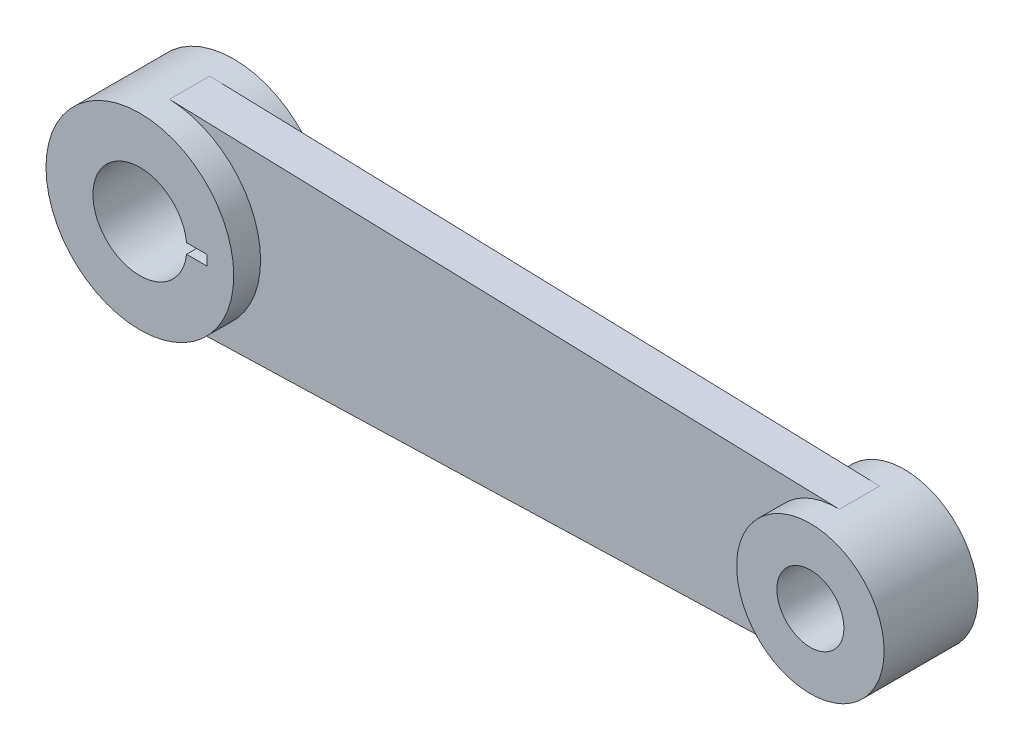
ISO-10303-21;
HEADER;
FILE_DESCRIPTION(('STEP AP214'),'2;1');
FILE_NAME('part.step','',(''),(''),'','','');
FILE_SCHEMA(('AUTOMOTIVE_DESIGN { 1 0 10303 214 1 1 1 1 }'));
ENDSEC;
DATA;
#1=APPLICATION_CONTEXT('core data for automotive mechanical design processes');
#2=APPLICATION_PROTOCOL_DEFINITION('international standard','automotive_design',2000,#1);
#3=PRODUCT_CONTEXT('',#1,'mechanical');
#4=PRODUCT('Part','Part','',(#3));
#5=PRODUCT_RELATED_PRODUCT_CATEGORY('part','',(#4));
#6=PRODUCT_DEFINITION_FORMATION('','',#4);
#7=PRODUCT_DEFINITION_CONTEXT('part definition',#1,'design');
#8=PRODUCT_DEFINITION('design','',#6,#7);
#9=PRODUCT_DEFINITION_SHAPE('','',#8);
#10=(LENGTH_UNIT() NAMED_UNIT(*) SI_UNIT(.MILLI.,.METRE.));
#11=(NAMED_UNIT(*) PLANE_ANGLE_UNIT() SI_UNIT($,.RADIAN.));
#12=(NAMED_UNIT(*) SI_UNIT($,.STERADIAN.) SOLID_ANGLE_UNIT());
#13=UNCERTAINTY_MEASURE_WITH_UNIT(LENGTH_MEASURE(1.E-05),#10,'distance_accuracy_value','');
#14=(GEOMETRIC_REPRESENTATION_CONTEXT(3) GLOBAL_UNCERTAINTY_ASSIGNED_CONTEXT((#13)) GLOBAL_UNIT_ASSIGNED_CONTEXT((#10,
#11,#12)) REPRESENTATION_CONTEXT('',''));
#15=CARTESIAN_POINT('',(0.,0.,0.));
#16=DIRECTION('',(0.,0.,1.));
#17=DIRECTION('',(1.,0.,0.));
#18=AXIS2_PLACEMENT_3D('',#15,#16,#17);
#19=CARTESIAN_POINT('',(-27.2035241619968,0.,6.));
#20=DIRECTION('',(0.,0.,-1.));
#21=DIRECTION('',(-1.,0.,0.));
#22=AXIS2_PLACEMENT_3D('',#19,#20,#21);
#23=PLANE('',#22);
#24=CARTESIAN_POINT('',(72.7964758380032,0.,6.));
#25=DIRECTION('',(0.,0.,-1.));
#26=DIRECTION('',(-1.,0.,0.));
#27=AXIS2_PLACEMENT_3D('',#24,#25,#26);
#28=CIRCLE('',#27,11.);
#29=CARTESIAN_POINT('',(73.1264758380032,10.9950488857485,6.));
#30=VERTEX_POINT('',#29);
#31=CARTESIAN_POINT('',(73.1264758380032,-10.9950488857485,6.));
#32=VERTEX_POINT('',#31);
#33=EDGE_CURVE('E149',#30,#32,#28,.F.);
#34=ORIENTED_EDGE('',*,*,#33,.F.);
#35=DIRECTION('',(-0.999549898704412,0.03,0.));
#36=VECTOR('',#35,1.);
#37=CARTESIAN_POINT('',(-26.7835241619968,13.9936985818618,6.));
#38=LINE('',#37,#36);
#39=CARTESIAN_POINT('',(-26.7835241619968,13.9936985818618,6.));
#40=VERTEX_POINT('',#39);
#41=EDGE_CURVE('E165',#30,#40,#38,.T.);
#42=ORIENTED_EDGE('',*,*,#41,.T.);
#43=CARTESIAN_POINT('',(-27.2035241619968,0.,6.));
#44=DIRECTION('',(0.,0.,-1.));
#45=DIRECTION('',(-1.,0.,0.));
#46=AXIS2_PLACEMENT_3D('',#43,#44,#45);
#47=CIRCLE('',#46,14.);
#48=CARTESIAN_POINT('',(-26.7835241619968,-13.9936985818618,6.));
#49=VERTEX_POINT('',#48);
#50=EDGE_CURVE('E156',#49,#40,#47,.F.);
#51=ORIENTED_EDGE('',*,*,#50,.F.);
#52=DIRECTION('',(0.999549898704412,0.03,0.));
#53=VECTOR('',#52,1.);
#54=CARTESIAN_POINT('',(73.1264758380032,-10.9950488857485,6.));
#55=LINE('',#54,#53);
#56=EDGE_CURVE('E162',#49,#32,#55,.T.);
#57=ORIENTED_EDGE('',*,*,#56,.T.);
#58=EDGE_LOOP('',(#34,#42,#51,#57));
#59=FACE_BOUND('',#58,.T.);
#60=ADVANCED_FACE('F35',(#59),#23,.F.);
#61=CARTESIAN_POINT('',(-27.2035241619968,0.,0.));
#62=DIRECTION('',(0.,0.,-1.));
#63=DIRECTION('',(-1.,0.,0.));
#64=AXIS2_PLACEMENT_3D('',#61,#62,#63);
#65=PLANE('',#64);
#66=DIRECTION('',(-0.999549898704412,0.03,0.));
#67=VECTOR('',#66,1.);
#68=CARTESIAN_POINT('',(-26.7835241619968,13.9936985818618,0.));
#69=LINE('',#68,#67);
#70=CARTESIAN_POINT('',(73.1264758380032,10.9950488857485,0.));
#71=VERTEX_POINT('',#70);
#72=CARTESIAN_POINT('',(-26.7835241619968,13.9936985818618,0.));
#73=VERTEX_POINT('',#72);
#74=EDGE_CURVE('E166',#71,#73,#69,.T.);
#75=ORIENTED_EDGE('',*,*,#74,.F.);
#76=CARTESIAN_POINT('',(72.7964758380032,0.,0.));
#77=DIRECTION('',(0.,0.,-1.));
#78=DIRECTION('',(-1.,0.,0.));
#79=AXIS2_PLACEMENT_3D('',#76,#77,#78);
#80=CIRCLE('',#79,11.);
#81=CARTESIAN_POINT('',(73.1264758380032,-10.9950488857485,0.));
#82=VERTEX_POINT('',#81);
#83=EDGE_CURVE('E145',#71,#82,#80,.F.);
#84=ORIENTED_EDGE('',*,*,#83,.T.);
#85=DIRECTION('',(0.999549898704412,0.03,0.));
#86=VECTOR('',#85,1.);
#87=CARTESIAN_POINT('',(73.1264758380032,-10.9950488857485,0.));
#88=LINE('',#87,#86);
#89=CARTESIAN_POINT('',(-26.7835241619968,-13.9936985818618,0.));
#90=VERTEX_POINT('',#89);
#91=EDGE_CURVE('E161',#90,#82,#88,.T.);
#92=ORIENTED_EDGE('',*,*,#91,.F.);
#93=CARTESIAN_POINT('',(-27.2035241619968,0.,0.));
#94=DIRECTION('',(0.,0.,-1.));
#95=DIRECTION('',(-1.,0.,0.));
#96=AXIS2_PLACEMENT_3D('',#93,#94,#95);
#97=CIRCLE('',#96,14.);
#98=EDGE_CURVE('E11',#90,#73,#97,.F.);
#99=ORIENTED_EDGE('',*,*,#98,.T.);
#100=EDGE_LOOP('',(#75,#84,#92,#99));
#101=FACE_BOUND('',#100,.T.);
#102=ADVANCED_FACE('F191',(#101),#65,.T.);
#103=CARTESIAN_POINT('',(-27.2035241619968,0.,6.));
#104=DIRECTION('',(0.,0.,-1.));
#105=DIRECTION('',(-1.,0.,0.));
#106=AXIS2_PLACEMENT_3D('',#103,#104,#105);
#107=CYLINDRICAL_SURFACE('',#106,14.);
#108=DIRECTION('',(0.,0.,-1.));
#109=VECTOR('',#108,1.);
#110=CARTESIAN_POINT('',(-26.7835241619968,13.9936985818618,6.));
#111=LINE('',#110,#109);
#112=EDGE_CURVE('E168',#40,#73,#111,.T.);
#113=ORIENTED_EDGE('',*,*,#112,.T.);
#114=ORIENTED_EDGE('',*,*,#98,.F.);
#115=DIRECTION('',(0.,0.,-1.));
#116=VECTOR('',#115,1.);
#117=CARTESIAN_POINT('',(-26.7835241619968,-13.9936985818618,6.));
#118=LINE('',#117,#116);
#119=EDGE_CURVE('E43',#49,#90,#118,.T.);
#120=ORIENTED_EDGE('',*,*,#119,.F.);
#121=ORIENTED_EDGE('',*,*,#50,.T.);
#122=EDGE_LOOP('',(#113,#114,#120,#121));
#123=FACE_BOUND('',#122,.T.);
#124=CARTESIAN_POINT('',(-27.2035241619968,0.,-4.));
#125=DIRECTION('',(0.,0.,1.));
#126=DIRECTION('',(1.,0.,0.));
#127=AXIS2_PLACEMENT_3D('',#124,#125,#126);
#128=CIRCLE('',#127,14.);
#129=CARTESIAN_POINT('',(-13.2035241619968,0.,-4.));
#130=VERTEX_POINT('',#129);
#131=EDGE_CURVE('E152',#130,#130,#128,.T.);
#132=ORIENTED_EDGE('',*,*,#131,.T.);
#133=EDGE_LOOP('',(#132));
#134=FACE_BOUND('',#133,.T.);
#135=CARTESIAN_POINT('',(-27.2035241619968,0.,10.));
#136=DIRECTION('',(0.,0.,1.));
#137=DIRECTION('',(1.,0.,0.));
#138=AXIS2_PLACEMENT_3D('',#135,#136,#137);
#139=CIRCLE('',#138,14.);
#140=CARTESIAN_POINT('',(-13.2035241619968,0.,10.));
#141=VERTEX_POINT('',#140);
#142=EDGE_CURVE('E153',#141,#141,#139,.T.);
#143=ORIENTED_EDGE('',*,*,#142,.F.);
#144=EDGE_LOOP('',(#143));
#145=FACE_BOUND('',#144,.T.);
#146=ADVANCED_FACE('F37',(#123,#134,#145),#107,.T.);
#147=CARTESIAN_POINT('',(73.1264758380032,-10.9950488857485,6.));
#148=DIRECTION('',(-0.03,0.999549898704412,0.));
#149=DIRECTION('',(-0.999549898704412,-0.03,0.));
#150=AXIS2_PLACEMENT_3D('',#147,#148,#149);
#151=PLANE('',#150);
#152=ORIENTED_EDGE('',*,*,#91,.T.);
#153=DIRECTION('',(0.,0.,-1.));
#154=VECTOR('',#153,1.);
#155=CARTESIAN_POINT('',(73.1264758380032,-10.9950488857485,6.));
#156=LINE('',#155,#154);
#157=EDGE_CURVE('E178',#32,#82,#156,.T.);
#158=ORIENTED_EDGE('',*,*,#157,.F.);
#159=ORIENTED_EDGE('',*,*,#56,.F.);
#160=ORIENTED_EDGE('',*,*,#119,.T.);
#161=EDGE_LOOP('',(#152,#158,#159,#160));
#162=FACE_BOUND('',#161,.T.);
#163=ADVANCED_FACE('F183',(#162),#151,.F.);
#164=CARTESIAN_POINT('',(72.7964758380032,0.,6.));
#165=DIRECTION('',(0.,0.,-1.));
#166=DIRECTION('',(-1.,0.,0.));
#167=AXIS2_PLACEMENT_3D('',#164,#165,#166);
#168=CYLINDRICAL_SURFACE('',#167,11.);
#169=ORIENTED_EDGE('',*,*,#157,.T.);
#170=ORIENTED_EDGE('',*,*,#83,.F.);
#171=DIRECTION('',(0.,0.,-1.));
#172=VECTOR('',#171,1.);
#173=CARTESIAN_POINT('',(73.1264758380032,10.9950488857485,6.));
#174=LINE('',#173,#172);
#175=EDGE_CURVE('E175',#30,#71,#174,.T.);
#176=ORIENTED_EDGE('',*,*,#175,.F.);
#177=ORIENTED_EDGE('',*,*,#33,.T.);
#178=EDGE_LOOP('',(#169,#170,#176,#177));
#179=FACE_BOUND('',#178,.T.);
#180=CARTESIAN_POINT('',(72.7964758380032,0.,-4.));
#181=DIRECTION('',(0.,0.,1.));
#182=DIRECTION('',(1.,0.,0.));
#183=AXIS2_PLACEMENT_3D('',#180,#181,#182);
#184=CIRCLE('',#183,11.);
#185=CARTESIAN_POINT('',(83.7964758380032,0.,-4.));
#186=VERTEX_POINT('',#185);
#187=EDGE_CURVE('E139',#186,#186,#184,.T.);
#188=ORIENTED_EDGE('',*,*,#187,.T.);
#189=EDGE_LOOP('',(#188));
#190=FACE_BOUND('',#189,.T.);
#191=CARTESIAN_POINT('',(72.7964758380032,0.,10.));
#192=DIRECTION('',(0.,0.,1.));
#193=DIRECTION('',(1.,0.,0.));
#194=AXIS2_PLACEMENT_3D('',#191,#192,#193);
#195=CIRCLE('',#194,11.);
#196=CARTESIAN_POINT('',(83.7964758380032,0.,10.));
#197=VERTEX_POINT('',#196);
#198=EDGE_CURVE('E142',#197,#197,#195,.T.);
#199=ORIENTED_EDGE('',*,*,#198,.F.);
#200=EDGE_LOOP('',(#199));
#201=FACE_BOUND('',#200,.T.);
#202=ADVANCED_FACE('F194',(#179,#190,#201),#168,.T.);
#203=CARTESIAN_POINT('',(-26.7835241619968,13.9936985818618,6.));
#204=DIRECTION('',(-0.03,-0.999549898704412,0.));
#205=DIRECTION('',(0.999549898704412,-0.03,0.));
#206=AXIS2_PLACEMENT_3D('',#203,#204,#205);
#207=PLANE('',#206);
#208=ORIENTED_EDGE('',*,*,#74,.T.);
#209=ORIENTED_EDGE('',*,*,#112,.F.);
#210=ORIENTED_EDGE('',*,*,#41,.F.);
#211=ORIENTED_EDGE('',*,*,#175,.T.);
#212=EDGE_LOOP('',(#208,#209,#210,#211));
#213=FACE_BOUND('',#212,.T.);
#214=ADVANCED_FACE('F198',(#213),#207,.F.);
#215=CARTESIAN_POINT('',(-27.2035241619968,0.,-4.));
#216=DIRECTION('',(0.,0.,1.));
#217=DIRECTION('',(1.,0.,0.));
#218=AXIS2_PLACEMENT_3D('',#215,#216,#217);
#219=PLANE('',#218);
#220=DIRECTION('',(-1.,0.,0.));
#221=VECTOR('',#220,1.);
#222=CARTESIAN_POINT('',(-20.2438187084593,0.75,-4.));
#223=LINE('',#222,#221);
#224=CARTESIAN_POINT('',(-17.2035241619968,0.75,-4.));
#225=VERTEX_POINT('',#224);
#226=CARTESIAN_POINT('',(-20.2438187084593,0.75,-4.));
#227=VERTEX_POINT('',#226);
#228=EDGE_CURVE('E107',#225,#227,#223,.T.);
#229=ORIENTED_EDGE('',*,*,#228,.T.);
#230=CARTESIAN_POINT('',(-27.2035241619968,0.,-4.));
#231=DIRECTION('',(0.,0.,1.));
#232=DIRECTION('',(1.,0.,0.));
#233=AXIS2_PLACEMENT_3D('',#230,#231,#232);
#234=CIRCLE('',#233,7.);
#235=CARTESIAN_POINT('',(-20.2438187084593,-0.75,-4.));
#236=VERTEX_POINT('',#235);
#237=EDGE_CURVE('E101',#227,#236,#234,.T.);
#238=ORIENTED_EDGE('',*,*,#237,.T.);
#239=DIRECTION('',(1.,0.,0.));
#240=VECTOR('',#239,1.);
#241=CARTESIAN_POINT('',(-20.2438187084593,-0.75,-4.));
#242=LINE('',#241,#240);
#243=CARTESIAN_POINT('',(-17.2035241619968,-0.75,-4.));
#244=VERTEX_POINT('',#243);
#245=EDGE_CURVE('E110',#236,#244,#242,.T.);
#246=ORIENTED_EDGE('',*,*,#245,.T.);
#247=DIRECTION('',(0.,1.,0.));
#248=VECTOR('',#247,1.);
#249=CARTESIAN_POINT('',(-17.2035241619968,0.75,-4.));
#250=LINE('',#249,#248);
#251=EDGE_CURVE('E50',#244,#225,#250,.T.);
#252=ORIENTED_EDGE('',*,*,#251,.T.);
#253=EDGE_LOOP('',(#229,#238,#246,#252));
#254=FACE_BOUND('',#253,.T.);
#255=ORIENTED_EDGE('',*,*,#131,.F.);
#256=EDGE_LOOP('',(#255));
#257=FACE_BOUND('',#256,.T.);
#258=ADVANCED_FACE('F114',(#254,#257),#219,.F.);
#259=CARTESIAN_POINT('',(-27.2035241619968,0.,10.));
#260=DIRECTION('',(0.,0.,1.));
#261=DIRECTION('',(1.,0.,0.));
#262=AXIS2_PLACEMENT_3D('',#259,#260,#261);
#263=PLANE('',#262);
#264=CARTESIAN_POINT('',(-27.2035241619968,0.,10.));
#265=DIRECTION('',(0.,0.,1.));
#266=DIRECTION('',(1.,0.,0.));
#267=AXIS2_PLACEMENT_3D('',#264,#265,#266);
#268=CIRCLE('',#267,7.);
#269=CARTESIAN_POINT('',(-20.2438187084593,0.75,10.));
#270=VERTEX_POINT('',#269);
#271=CARTESIAN_POINT('',(-20.2438187084593,-0.75,10.));
#272=VERTEX_POINT('',#271);
#273=EDGE_CURVE('E58',#270,#272,#268,.T.);
#274=ORIENTED_EDGE('',*,*,#273,.F.);
#275=DIRECTION('',(-1.,0.,0.));
#276=VECTOR('',#275,1.);
#277=CARTESIAN_POINT('',(-20.2438187084593,0.75,10.));
#278=LINE('',#277,#276);
#279=CARTESIAN_POINT('',(-17.2035241619968,0.75,10.));
#280=VERTEX_POINT('',#279);
#281=EDGE_CURVE('E117',#280,#270,#278,.T.);
#282=ORIENTED_EDGE('',*,*,#281,.F.);
#283=DIRECTION('',(0.,1.,0.));
#284=VECTOR('',#283,1.);
#285=CARTESIAN_POINT('',(-17.2035241619968,0.75,10.));
#286=LINE('',#285,#284);
#287=CARTESIAN_POINT('',(-17.2035241619968,-0.75,10.));
#288=VERTEX_POINT('',#287);
#289=EDGE_CURVE('E120',#288,#280,#286,.T.);
#290=ORIENTED_EDGE('',*,*,#289,.F.);
#291=DIRECTION('',(1.,0.,0.));
#292=VECTOR('',#291,1.);
#293=CARTESIAN_POINT('',(-20.2438187084593,-0.75,10.));
#294=LINE('',#293,#292);
#295=EDGE_CURVE('E126',#272,#288,#294,.T.);
#296=ORIENTED_EDGE('',*,*,#295,.F.);
#297=EDGE_LOOP('',(#274,#282,#290,#296));
#298=FACE_BOUND('',#297,.T.);
#299=ORIENTED_EDGE('',*,*,#142,.T.);
#300=EDGE_LOOP('',(#299));
#301=FACE_BOUND('',#300,.T.);
#302=ADVANCED_FACE('F252',(#298,#301),#263,.T.);
#303=CARTESIAN_POINT('',(72.7964758380032,0.,-4.));
#304=DIRECTION('',(0.,0.,1.));
#305=DIRECTION('',(1.,0.,0.));
#306=AXIS2_PLACEMENT_3D('',#303,#304,#305);
#307=PLANE('',#306);
#308=CARTESIAN_POINT('',(72.7964758380032,0.,-4.));
#309=DIRECTION('',(0.,0.,1.));
#310=DIRECTION('',(1.,0.,0.));
#311=AXIS2_PLACEMENT_3D('',#308,#309,#310);
#312=CIRCLE('',#311,5.);
#313=CARTESIAN_POINT('',(77.7964758380032,0.,-4.));
#314=VERTEX_POINT('',#313);
#315=EDGE_CURVE('E136',#314,#314,#312,.T.);
#316=ORIENTED_EDGE('',*,*,#315,.T.);
#317=EDGE_LOOP('',(#316));
#318=FACE_BOUND('',#317,.T.);
#319=ORIENTED_EDGE('',*,*,#187,.F.);
#320=EDGE_LOOP('',(#319));
#321=FACE_BOUND('',#320,.T.);
#322=ADVANCED_FACE('F259',(#318,#321),#307,.F.);
#323=CARTESIAN_POINT('',(72.7964758380032,0.,10.));
#324=DIRECTION('',(0.,0.,1.));
#325=DIRECTION('',(1.,0.,0.));
#326=AXIS2_PLACEMENT_3D('',#323,#324,#325);
#327=PLANE('',#326);
#328=CARTESIAN_POINT('',(72.7964758380032,0.,10.));
#329=DIRECTION('',(0.,0.,1.));
#330=DIRECTION('',(1.,0.,0.));
#331=AXIS2_PLACEMENT_3D('',#328,#329,#330);
#332=CIRCLE('',#331,5.);
#333=CARTESIAN_POINT('',(77.7964758380032,0.,10.));
#334=VERTEX_POINT('',#333);
#335=EDGE_CURVE('E132',#334,#334,#332,.T.);
#336=ORIENTED_EDGE('',*,*,#335,.F.);
#337=EDGE_LOOP('',(#336));
#338=FACE_BOUND('',#337,.T.);
#339=ORIENTED_EDGE('',*,*,#198,.T.);
#340=EDGE_LOOP('',(#339));
#341=FACE_BOUND('',#340,.T.);
#342=ADVANCED_FACE('F267',(#338,#341),#327,.T.);
#343=CARTESIAN_POINT('',(72.7964758380032,0.,-4.));
#344=DIRECTION('',(0.,0.,1.));
#345=DIRECTION('',(1.,0.,0.));
#346=AXIS2_PLACEMENT_3D('',#343,#344,#345);
#347=CYLINDRICAL_SURFACE('',#346,5.);
#348=ORIENTED_EDGE('',*,*,#315,.F.);
#349=EDGE_LOOP('',(#348));
#350=FACE_BOUND('',#349,.T.);
#351=ORIENTED_EDGE('',*,*,#335,.T.);
#352=EDGE_LOOP('',(#351));
#353=FACE_BOUND('',#352,.T.);
#354=ADVANCED_FACE('F276',(#350,#353),#347,.F.);
#355=CARTESIAN_POINT('',(-27.2035241619968,0.,-4.));
#356=DIRECTION('',(0.,0.,1.));
#357=DIRECTION('',(1.,0.,0.));
#358=AXIS2_PLACEMENT_3D('',#355,#356,#357);
#359=CYLINDRICAL_SURFACE('',#358,7.);
#360=ORIENTED_EDGE('',*,*,#273,.T.);
#361=DIRECTION('',(0.,0.,1.));
#362=VECTOR('',#361,1.);
#363=CARTESIAN_POINT('',(-20.2438187084593,-0.75,-4.));
#364=LINE('',#363,#362);
#365=EDGE_CURVE('E97',#236,#272,#364,.T.);
#366=ORIENTED_EDGE('',*,*,#365,.F.);
#367=ORIENTED_EDGE('',*,*,#237,.F.);
#368=DIRECTION('',(0.,0.,1.));
#369=VECTOR('',#368,1.);
#370=CARTESIAN_POINT('',(-20.2438187084593,0.75,-4.));
#371=LINE('',#370,#369);
#372=EDGE_CURVE('E130',#227,#270,#371,.T.);
#373=ORIENTED_EDGE('',*,*,#372,.T.);
#374=EDGE_LOOP('',(#360,#366,#367,#373));
#375=FACE_BOUND('',#374,.T.);
#376=ADVANCED_FACE('F99',(#375),#359,.F.);
#377=CARTESIAN_POINT('',(-20.2438187084593,0.75,-4.));
#378=DIRECTION('',(0.,1.,0.));
#379=DIRECTION('',(0.,0.,1.));
#380=AXIS2_PLACEMENT_3D('',#377,#378,#379);
#381=PLANE('',#380);
#382=ORIENTED_EDGE('',*,*,#281,.T.);
#383=ORIENTED_EDGE('',*,*,#372,.F.);
#384=ORIENTED_EDGE('',*,*,#228,.F.);
#385=DIRECTION('',(0.,0.,1.));
#386=VECTOR('',#385,1.);
#387=CARTESIAN_POINT('',(-17.2035241619968,0.75,-4.));
#388=LINE('',#387,#386);
#389=EDGE_CURVE('E133',#225,#280,#388,.T.);
#390=ORIENTED_EDGE('',*,*,#389,.T.);
#391=EDGE_LOOP('',(#382,#383,#384,#390));
#392=FACE_BOUND('',#391,.T.);
#393=ADVANCED_FACE('F293',(#392),#381,.F.);
#394=CARTESIAN_POINT('',(-17.2035241619968,0.75,-4.));
#395=DIRECTION('',(1.,0.,0.));
#396=DIRECTION('',(0.,0.,-1.));
#397=AXIS2_PLACEMENT_3D('',#394,#395,#396);
#398=PLANE('',#397);
#399=ORIENTED_EDGE('',*,*,#289,.T.);
#400=ORIENTED_EDGE('',*,*,#389,.F.);
#401=ORIENTED_EDGE('',*,*,#251,.F.);
#402=DIRECTION('',(0.,0.,1.));
#403=VECTOR('',#402,1.);
#404=CARTESIAN_POINT('',(-17.2035241619968,-0.75,-4.));
#405=LINE('',#404,#403);
#406=EDGE_CURVE('E106',#244,#288,#405,.T.);
#407=ORIENTED_EDGE('',*,*,#406,.T.);
#408=EDGE_LOOP('',(#399,#400,#401,#407));
#409=FACE_BOUND('',#408,.T.);
#410=ADVANCED_FACE('F301',(#409),#398,.F.);
#411=CARTESIAN_POINT('',(-20.2438187084593,-0.75,-4.));
#412=DIRECTION('',(0.,-1.,0.));
#413=DIRECTION('',(1.,0.,0.));
#414=AXIS2_PLACEMENT_3D('',#411,#412,#413);
#415=PLANE('',#414);
#416=ORIENTED_EDGE('',*,*,#295,.T.);
#417=ORIENTED_EDGE('',*,*,#406,.F.);
#418=ORIENTED_EDGE('',*,*,#245,.F.);
#419=ORIENTED_EDGE('',*,*,#365,.T.);
#420=EDGE_LOOP('',(#416,#417,#418,#419));
#421=FACE_BOUND('',#420,.T.);
#422=ADVANCED_FACE('F111',(#421),#415,.F.);
#423=CLOSED_SHELL('',(#60,#102,#146,#163,#202,#214,#258,#302,#322,#342,#354,#376,#393,#410,#422));
#424=MANIFOLD_SOLID_BREP('B2',#423);
#425=ADVANCED_BREP_SHAPE_REPRESENTATION('',(#18,#424),#14);
#426=SHAPE_DEFINITION_REPRESENTATION(#9,#425);
ENDSEC;
END-ISO-10303-21;
